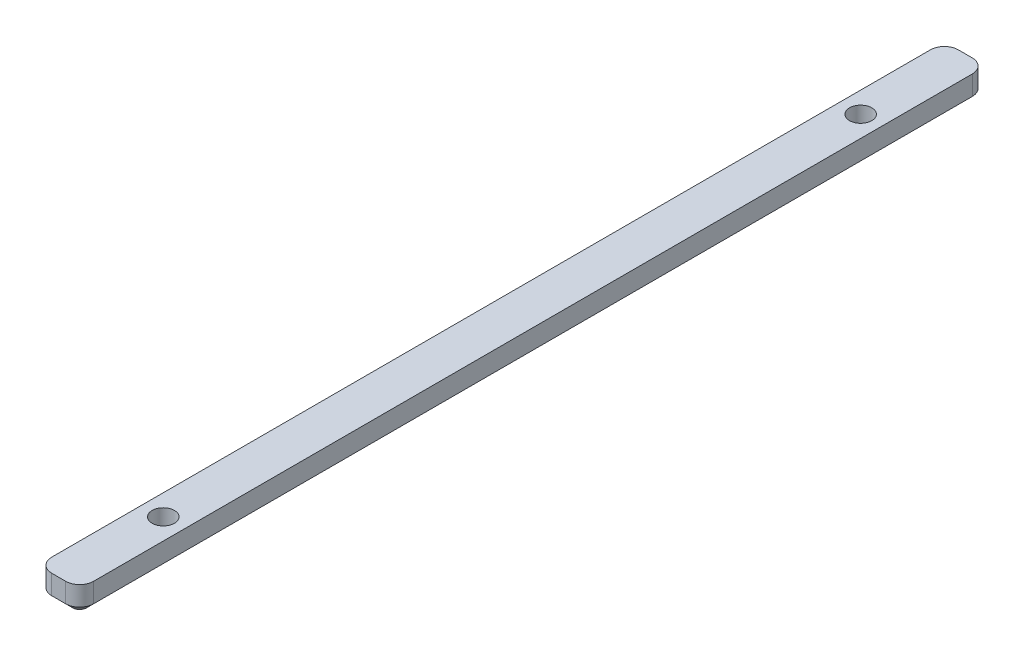
ISO-10303-21;
HEADER;
FILE_DESCRIPTION(('STEP AP214'),'2;1');
FILE_NAME('part.step','',(''),(''),'','','');
FILE_SCHEMA(('AUTOMOTIVE_DESIGN { 1 0 10303 214 1 1 1 1 }'));
ENDSEC;
DATA;
#1=APPLICATION_CONTEXT('core data for automotive mechanical design processes');
#2=APPLICATION_PROTOCOL_DEFINITION('international standard','automotive_design',2000,#1);
#3=PRODUCT_CONTEXT('',#1,'mechanical');
#4=PRODUCT('Part','Part','',(#3));
#5=PRODUCT_RELATED_PRODUCT_CATEGORY('part','',(#4));
#6=PRODUCT_DEFINITION_FORMATION('','',#4);
#7=PRODUCT_DEFINITION_CONTEXT('part definition',#1,'design');
#8=PRODUCT_DEFINITION('design','',#6,#7);
#9=PRODUCT_DEFINITION_SHAPE('','',#8);
#10=(LENGTH_UNIT() NAMED_UNIT(*) SI_UNIT(.MILLI.,.METRE.));
#11=(NAMED_UNIT(*) PLANE_ANGLE_UNIT() SI_UNIT($,.RADIAN.));
#12=(NAMED_UNIT(*) SI_UNIT($,.STERADIAN.) SOLID_ANGLE_UNIT());
#13=UNCERTAINTY_MEASURE_WITH_UNIT(LENGTH_MEASURE(1.E-05),#10,'distance_accuracy_value','');
#14=(GEOMETRIC_REPRESENTATION_CONTEXT(3) GLOBAL_UNCERTAINTY_ASSIGNED_CONTEXT((#13)) GLOBAL_UNIT_ASSIGNED_CONTEXT((#10,
#11,#12)) REPRESENTATION_CONTEXT('',''));
#15=CARTESIAN_POINT('',(0.,0.,0.));
#16=DIRECTION('',(0.,0.,1.));
#17=DIRECTION('',(1.,0.,0.));
#18=AXIS2_PLACEMENT_3D('',#15,#16,#17);
#19=CARTESIAN_POINT('',(0.,-9.15,176.));
#20=DIRECTION('',(0.,-1.,0.));
#21=DIRECTION('',(0.,0.,-1.));
#22=AXIS2_PLACEMENT_3D('',#19,#20,#21);
#23=PLANE('',#22);
#24=CARTESIAN_POINT('',(0.,-9.15,149.));
#25=DIRECTION('',(0.,-1.,0.));
#26=DIRECTION('',(0.,0.,-1.));
#27=AXIS2_PLACEMENT_3D('',#24,#25,#26);
#28=CIRCLE('',#27,4.25);
#29=CARTESIAN_POINT('',(-4.25000000000002,-9.15,149.));
#30=VERTEX_POINT('',#29);
#31=CARTESIAN_POINT('',(4.24999999999998,-9.15,149.));
#32=VERTEX_POINT('',#31);
#33=EDGE_CURVE('E19',#30,#32,#28,.T.);
#34=ORIENTED_EDGE('',*,*,#33,.T.);
#35=DIRECTION('',(0.,0.,-1.));
#36=VECTOR('',#35,1.);
#37=CARTESIAN_POINT('',(4.24999999999998,-9.15,176.));
#38=LINE('',#37,#36);
#39=CARTESIAN_POINT('',(4.24999999999998,-9.15,176.));
#40=VERTEX_POINT('',#39);
#41=EDGE_CURVE('E154',#32,#40,#38,.F.);
#42=ORIENTED_EDGE('',*,*,#41,.T.);
#43=CARTESIAN_POINT('',(0.,-9.15,176.));
#44=DIRECTION('',(0.,-1.,0.));
#45=DIRECTION('',(0.,0.,-1.));
#46=AXIS2_PLACEMENT_3D('',#43,#44,#45);
#47=CIRCLE('',#46,4.25);
#48=CARTESIAN_POINT('',(-4.25000000000002,-9.15,176.));
#49=VERTEX_POINT('',#48);
#50=EDGE_CURVE('E274',#40,#49,#47,.T.);
#51=ORIENTED_EDGE('',*,*,#50,.T.);
#52=DIRECTION('',(0.,0.,1.));
#53=VECTOR('',#52,1.);
#54=CARTESIAN_POINT('',(-4.25000000000002,-9.15,176.));
#55=LINE('',#54,#53);
#56=EDGE_CURVE('E157',#49,#30,#55,.F.);
#57=ORIENTED_EDGE('',*,*,#56,.T.);
#58=EDGE_LOOP('',(#34,#42,#51,#57));
#59=FACE_BOUND('',#58,.T.);
#60=ADVANCED_FACE('F16',(#59),#23,.T.);
#61=CARTESIAN_POINT('',(0.,-9.15,11.5));
#62=DIRECTION('',(0.,-1.,0.));
#63=DIRECTION('',(0.,0.,-1.));
#64=AXIS2_PLACEMENT_3D('',#61,#62,#63);
#65=PLANE('',#64);
#66=CARTESIAN_POINT('',(0.,-9.15,38.5));
#67=DIRECTION('',(0.,-1.,0.));
#68=DIRECTION('',(0.,0.,-1.));
#69=AXIS2_PLACEMENT_3D('',#66,#67,#68);
#70=CIRCLE('',#69,4.25);
#71=CARTESIAN_POINT('',(4.25,-9.15,38.5));
#72=VERTEX_POINT('',#71);
#73=CARTESIAN_POINT('',(-4.25000000000001,-9.15,38.5));
#74=VERTEX_POINT('',#73);
#75=EDGE_CURVE('E273',#72,#74,#70,.T.);
#76=ORIENTED_EDGE('',*,*,#75,.T.);
#77=DIRECTION('',(0.,0.,1.));
#78=VECTOR('',#77,1.);
#79=CARTESIAN_POINT('',(-4.25,-9.15,11.5));
#80=LINE('',#79,#78);
#81=CARTESIAN_POINT('',(-4.25,-9.15,11.5));
#82=VERTEX_POINT('',#81);
#83=EDGE_CURVE('E191',#74,#82,#80,.F.);
#84=ORIENTED_EDGE('',*,*,#83,.T.);
#85=CARTESIAN_POINT('',(0.,-9.15,11.5));
#86=DIRECTION('',(0.,-1.,0.));
#87=DIRECTION('',(0.,0.,-1.));
#88=AXIS2_PLACEMENT_3D('',#85,#86,#87);
#89=CIRCLE('',#88,4.25);
#90=CARTESIAN_POINT('',(4.25,-9.15,11.5));
#91=VERTEX_POINT('',#90);
#92=EDGE_CURVE('E271',#82,#91,#89,.T.);
#93=ORIENTED_EDGE('',*,*,#92,.T.);
#94=DIRECTION('',(0.,0.,-1.));
#95=VECTOR('',#94,1.);
#96=CARTESIAN_POINT('',(4.25,-9.15,11.5));
#97=LINE('',#96,#95);
#98=EDGE_CURVE('E186',#91,#72,#97,.F.);
#99=ORIENTED_EDGE('',*,*,#98,.T.);
#100=EDGE_LOOP('',(#76,#84,#93,#99));
#101=FACE_BOUND('',#100,.T.);
#102=ADVANCED_FACE('F321',(#101),#65,.T.);
#103=CARTESIAN_POINT('',(0.,-9.15,313.5));
#104=DIRECTION('',(0.,-1.,0.));
#105=DIRECTION('',(0.,0.,-1.));
#106=AXIS2_PLACEMENT_3D('',#103,#104,#105);
#107=PLANE('',#106);
#108=CARTESIAN_POINT('',(0.,-9.15,286.5));
#109=DIRECTION('',(0.,-1.,0.));
#110=DIRECTION('',(0.,0.,-1.));
#111=AXIS2_PLACEMENT_3D('',#108,#109,#110);
#112=CIRCLE('',#111,4.24999999999998);
#113=CARTESIAN_POINT('',(-4.25,-9.15,286.5));
#114=VERTEX_POINT('',#113);
#115=CARTESIAN_POINT('',(4.25000000000001,-9.15,286.5));
#116=VERTEX_POINT('',#115);
#117=EDGE_CURVE('E269',#114,#116,#112,.T.);
#118=ORIENTED_EDGE('',*,*,#117,.T.);
#119=DIRECTION('',(0.,0.,-1.));
#120=VECTOR('',#119,1.);
#121=CARTESIAN_POINT('',(4.25,-9.15,313.5));
#122=LINE('',#121,#120);
#123=CARTESIAN_POINT('',(4.25000000000002,-9.15,313.5));
#124=VERTEX_POINT('',#123);
#125=EDGE_CURVE('E182',#116,#124,#122,.F.);
#126=ORIENTED_EDGE('',*,*,#125,.T.);
#127=CARTESIAN_POINT('',(0.,-9.15,313.5));
#128=DIRECTION('',(0.,-1.,0.));
#129=DIRECTION('',(0.,0.,-1.));
#130=AXIS2_PLACEMENT_3D('',#127,#128,#129);
#131=CIRCLE('',#130,4.24999999999998);
#132=CARTESIAN_POINT('',(-4.25000000000001,-9.15,313.5));
#133=VERTEX_POINT('',#132);
#134=EDGE_CURVE('E267',#124,#133,#131,.T.);
#135=ORIENTED_EDGE('',*,*,#134,.T.);
#136=DIRECTION('',(0.,0.,1.));
#137=VECTOR('',#136,1.);
#138=CARTESIAN_POINT('',(-4.25000000000001,-9.15,313.5));
#139=LINE('',#138,#137);
#140=EDGE_CURVE('E177',#133,#114,#139,.F.);
#141=ORIENTED_EDGE('',*,*,#140,.T.);
#142=EDGE_LOOP('',(#118,#126,#135,#141));
#143=FACE_BOUND('',#142,.T.);
#144=ADVANCED_FACE('F805',(#143),#107,.T.);
#145=CARTESIAN_POINT('',(0.,-9.15,149.));
#146=DIRECTION('',(0.,-1.,0.));
#147=DIRECTION('',(0.,0.,-1.));
#148=AXIS2_PLACEMENT_3D('',#145,#146,#147);
#149=CYLINDRICAL_SURFACE('',#148,4.25);
#150=ORIENTED_EDGE('',*,*,#33,.F.);
#151=DIRECTION('',(0.,1.,0.));
#152=VECTOR('',#151,1.);
#153=CARTESIAN_POINT('',(-4.25000000000002,-9.15,149.));
#154=LINE('',#153,#152);
#155=CARTESIAN_POINT('',(-4.25000000000002,-9.5,149.));
#156=VERTEX_POINT('',#155);
#157=EDGE_CURVE('E196',#30,#156,#154,.F.);
#158=ORIENTED_EDGE('',*,*,#157,.T.);
#159=CARTESIAN_POINT('',(0.,-9.5,149.));
#160=DIRECTION('',(0.,-1.,0.));
#161=DIRECTION('',(0.,0.,-1.));
#162=AXIS2_PLACEMENT_3D('',#159,#160,#161);
#163=CIRCLE('',#162,4.25);
#164=CARTESIAN_POINT('',(4.24999999999998,-9.5,149.));
#165=VERTEX_POINT('',#164);
#166=EDGE_CURVE('E172',#156,#165,#163,.T.);
#167=ORIENTED_EDGE('',*,*,#166,.T.);
#168=DIRECTION('',(0.,1.,0.));
#169=VECTOR('',#168,1.);
#170=CARTESIAN_POINT('',(4.24999999999998,-9.15,149.));
#171=LINE('',#170,#169);
#172=EDGE_CURVE('E162',#165,#32,#171,.T.);
#173=ORIENTED_EDGE('',*,*,#172,.T.);
#174=EDGE_LOOP('',(#150,#158,#167,#173));
#175=FACE_BOUND('',#174,.T.);
#176=ADVANCED_FACE('F171',(#175),#149,.F.);
#177=CARTESIAN_POINT('',(4.24999999999998,-9.15,176.));
#178=DIRECTION('',(1.,0.,0.));
#179=DIRECTION('',(0.,0.,-1.));
#180=AXIS2_PLACEMENT_3D('',#177,#178,#179);
#181=PLANE('',#180);
#182=DIRECTION('',(0.,-1.,0.));
#183=VECTOR('',#182,1.);
#184=CARTESIAN_POINT('',(4.24999999999998,-9.15,176.));
#185=LINE('',#184,#183);
#186=CARTESIAN_POINT('',(4.24999999999998,-9.5,176.));
#187=VERTEX_POINT('',#186);
#188=EDGE_CURVE('E168',#187,#40,#185,.F.);
#189=ORIENTED_EDGE('',*,*,#188,.T.);
#190=ORIENTED_EDGE('',*,*,#41,.F.);
#191=ORIENTED_EDGE('',*,*,#172,.F.);
#192=DIRECTION('',(0.,0.,1.));
#193=VECTOR('',#192,1.);
#194=CARTESIAN_POINT('',(4.24999999999998,-9.5,325.));
#195=LINE('',#194,#193);
#196=EDGE_CURVE('E265',#165,#187,#195,.T.);
#197=ORIENTED_EDGE('',*,*,#196,.T.);
#198=EDGE_LOOP('',(#189,#190,#191,#197));
#199=FACE_BOUND('',#198,.T.);
#200=ADVANCED_FACE('F165',(#199),#181,.F.);
#201=CARTESIAN_POINT('',(0.,-9.15,176.));
#202=DIRECTION('',(0.,-1.,0.));
#203=DIRECTION('',(0.,0.,-1.));
#204=AXIS2_PLACEMENT_3D('',#201,#202,#203);
#205=CYLINDRICAL_SURFACE('',#204,4.25);
#206=DIRECTION('',(0.,1.,0.));
#207=VECTOR('',#206,1.);
#208=CARTESIAN_POINT('',(-4.25000000000002,-9.15,176.));
#209=LINE('',#208,#207);
#210=CARTESIAN_POINT('',(-4.25000000000002,-9.5,176.));
#211=VERTEX_POINT('',#210);
#212=EDGE_CURVE('E197',#211,#49,#209,.T.);
#213=ORIENTED_EDGE('',*,*,#212,.T.);
#214=ORIENTED_EDGE('',*,*,#50,.F.);
#215=ORIENTED_EDGE('',*,*,#188,.F.);
#216=CARTESIAN_POINT('',(0.,-9.5,176.));
#217=DIRECTION('',(0.,-1.,0.));
#218=DIRECTION('',(0.,0.,-1.));
#219=AXIS2_PLACEMENT_3D('',#216,#217,#218);
#220=CIRCLE('',#219,4.25);
#221=EDGE_CURVE('E262',#187,#211,#220,.T.);
#222=ORIENTED_EDGE('',*,*,#221,.T.);
#223=EDGE_LOOP('',(#213,#214,#215,#222));
#224=FACE_BOUND('',#223,.T.);
#225=ADVANCED_FACE('F783',(#224),#205,.F.);
#226=CARTESIAN_POINT('',(-4.25000000000002,-9.15,176.));
#227=DIRECTION('',(-1.,0.,0.));
#228=DIRECTION('',(0.,0.,1.));
#229=AXIS2_PLACEMENT_3D('',#226,#227,#228);
#230=PLANE('',#229);
#231=ORIENTED_EDGE('',*,*,#157,.F.);
#232=ORIENTED_EDGE('',*,*,#56,.F.);
#233=ORIENTED_EDGE('',*,*,#212,.F.);
#234=DIRECTION('',(0.,0.,1.));
#235=VECTOR('',#234,1.);
#236=CARTESIAN_POINT('',(-4.25000000000002,-9.5,325.));
#237=LINE('',#236,#235);
#238=EDGE_CURVE('E261',#211,#156,#237,.F.);
#239=ORIENTED_EDGE('',*,*,#238,.T.);
#240=EDGE_LOOP('',(#231,#232,#233,#239));
#241=FACE_BOUND('',#240,.T.);
#242=ADVANCED_FACE('F283',(#241),#230,.F.);
#243=CARTESIAN_POINT('',(0.,-9.15,38.5));
#244=DIRECTION('',(0.,-1.,0.));
#245=DIRECTION('',(0.,0.,-1.));
#246=AXIS2_PLACEMENT_3D('',#243,#244,#245);
#247=CYLINDRICAL_SURFACE('',#246,4.25);
#248=DIRECTION('',(0.,1.,0.));
#249=VECTOR('',#248,1.);
#250=CARTESIAN_POINT('',(-4.25000000000001,-9.15,38.5));
#251=LINE('',#250,#249);
#252=CARTESIAN_POINT('',(-4.25000000000001,-9.5,38.5));
#253=VERTEX_POINT('',#252);
#254=EDGE_CURVE('E195',#253,#74,#251,.T.);
#255=ORIENTED_EDGE('',*,*,#254,.T.);
#256=ORIENTED_EDGE('',*,*,#75,.F.);
#257=DIRECTION('',(0.,1.,0.));
#258=VECTOR('',#257,1.);
#259=CARTESIAN_POINT('',(4.25,-9.15,38.5));
#260=LINE('',#259,#258);
#261=CARTESIAN_POINT('',(4.25,-9.5,38.5));
#262=VERTEX_POINT('',#261);
#263=EDGE_CURVE('E189',#72,#262,#260,.F.);
#264=ORIENTED_EDGE('',*,*,#263,.T.);
#265=CARTESIAN_POINT('',(0.,-9.5,38.5));
#266=DIRECTION('',(0.,-1.,0.));
#267=DIRECTION('',(0.,0.,-1.));
#268=AXIS2_PLACEMENT_3D('',#265,#266,#267);
#269=CIRCLE('',#268,4.25);
#270=EDGE_CURVE('E258',#262,#253,#269,.T.);
#271=ORIENTED_EDGE('',*,*,#270,.T.);
#272=EDGE_LOOP('',(#255,#256,#264,#271));
#273=FACE_BOUND('',#272,.T.);
#274=ADVANCED_FACE('F324',(#273),#247,.F.);
#275=CARTESIAN_POINT('',(-4.25,-9.15,11.5));
#276=DIRECTION('',(-1.,0.,0.));
#277=DIRECTION('',(0.,0.,1.));
#278=AXIS2_PLACEMENT_3D('',#275,#276,#277);
#279=PLANE('',#278);
#280=DIRECTION('',(0.,-1.,0.));
#281=VECTOR('',#280,1.);
#282=CARTESIAN_POINT('',(-4.25,-9.15,11.5));
#283=LINE('',#282,#281);
#284=CARTESIAN_POINT('',(-4.25000000000001,-9.5,11.5));
#285=VERTEX_POINT('',#284);
#286=EDGE_CURVE('E194',#285,#82,#283,.F.);
#287=ORIENTED_EDGE('',*,*,#286,.T.);
#288=ORIENTED_EDGE('',*,*,#83,.F.);
#289=ORIENTED_EDGE('',*,*,#254,.F.);
#290=DIRECTION('',(0.,0.,1.));
#291=VECTOR('',#290,1.);
#292=CARTESIAN_POINT('',(-4.25000000000001,-9.5,325.));
#293=LINE('',#292,#291);
#294=EDGE_CURVE('E257',#253,#285,#293,.F.);
#295=ORIENTED_EDGE('',*,*,#294,.T.);
#296=EDGE_LOOP('',(#287,#288,#289,#295));
#297=FACE_BOUND('',#296,.T.);
#298=ADVANCED_FACE('F314',(#297),#279,.F.);
#299=CARTESIAN_POINT('',(0.,-9.15,11.5));
#300=DIRECTION('',(0.,-1.,0.));
#301=DIRECTION('',(0.,0.,-1.));
#302=AXIS2_PLACEMENT_3D('',#299,#300,#301);
#303=CYLINDRICAL_SURFACE('',#302,4.25);
#304=ORIENTED_EDGE('',*,*,#92,.F.);
#305=ORIENTED_EDGE('',*,*,#286,.F.);
#306=CARTESIAN_POINT('',(0.,-9.5,11.5));
#307=DIRECTION('',(0.,-1.,0.));
#308=DIRECTION('',(0.,0.,-1.));
#309=AXIS2_PLACEMENT_3D('',#306,#307,#308);
#310=CIRCLE('',#309,4.25);
#311=CARTESIAN_POINT('',(4.25000000000001,-9.5,11.5));
#312=VERTEX_POINT('',#311);
#313=EDGE_CURVE('E254',#285,#312,#310,.T.);
#314=ORIENTED_EDGE('',*,*,#313,.T.);
#315=DIRECTION('',(0.,1.,0.));
#316=VECTOR('',#315,1.);
#317=CARTESIAN_POINT('',(4.25,-9.15,11.5));
#318=LINE('',#317,#316);
#319=EDGE_CURVE('E190',#312,#91,#318,.T.);
#320=ORIENTED_EDGE('',*,*,#319,.T.);
#321=EDGE_LOOP('',(#304,#305,#314,#320));
#322=FACE_BOUND('',#321,.T.);
#323=ADVANCED_FACE('F318',(#322),#303,.F.);
#324=CARTESIAN_POINT('',(4.25,-9.15,11.5));
#325=DIRECTION('',(1.,0.,0.));
#326=DIRECTION('',(0.,0.,-1.));
#327=AXIS2_PLACEMENT_3D('',#324,#325,#326);
#328=PLANE('',#327);
#329=ORIENTED_EDGE('',*,*,#263,.F.);
#330=ORIENTED_EDGE('',*,*,#98,.F.);
#331=ORIENTED_EDGE('',*,*,#319,.F.);
#332=DIRECTION('',(0.,0.,1.));
#333=VECTOR('',#332,1.);
#334=CARTESIAN_POINT('',(4.25000000000001,-9.5,325.));
#335=LINE('',#334,#333);
#336=EDGE_CURVE('E253',#312,#262,#335,.T.);
#337=ORIENTED_EDGE('',*,*,#336,.T.);
#338=EDGE_LOOP('',(#329,#330,#331,#337));
#339=FACE_BOUND('',#338,.T.);
#340=ADVANCED_FACE('F327',(#339),#328,.F.);
#341=CARTESIAN_POINT('',(0.,-9.15,286.5));
#342=DIRECTION('',(0.,-1.,0.));
#343=DIRECTION('',(0.,0.,-1.));
#344=AXIS2_PLACEMENT_3D('',#341,#342,#343);
#345=CYLINDRICAL_SURFACE('',#344,4.24999999999998);
#346=ORIENTED_EDGE('',*,*,#117,.F.);
#347=DIRECTION('',(0.,1.,0.));
#348=VECTOR('',#347,1.);
#349=CARTESIAN_POINT('',(-4.25,-9.15,286.5));
#350=LINE('',#349,#348);
#351=CARTESIAN_POINT('',(-4.25,-9.5,286.5));
#352=VERTEX_POINT('',#351);
#353=EDGE_CURVE('E180',#114,#352,#350,.F.);
#354=ORIENTED_EDGE('',*,*,#353,.T.);
#355=CARTESIAN_POINT('',(0.,-9.5,286.5));
#356=DIRECTION('',(0.,-1.,0.));
#357=DIRECTION('',(0.,0.,-1.));
#358=AXIS2_PLACEMENT_3D('',#355,#356,#357);
#359=CIRCLE('',#358,4.24999999999998);
#360=CARTESIAN_POINT('',(4.25000000000001,-9.5,286.5));
#361=VERTEX_POINT('',#360);
#362=EDGE_CURVE('E250',#352,#361,#359,.T.);
#363=ORIENTED_EDGE('',*,*,#362,.T.);
#364=DIRECTION('',(0.,1.,0.));
#365=VECTOR('',#364,1.);
#366=CARTESIAN_POINT('',(4.25000000000001,-9.15,286.5));
#367=LINE('',#366,#365);
#368=EDGE_CURVE('E185',#361,#116,#367,.T.);
#369=ORIENTED_EDGE('',*,*,#368,.T.);
#370=EDGE_LOOP('',(#346,#354,#363,#369));
#371=FACE_BOUND('',#370,.T.);
#372=ADVANCED_FACE('F738',(#371),#345,.F.);
#373=CARTESIAN_POINT('',(4.25,-9.15,313.5));
#374=DIRECTION('',(1.,0.,0.));
#375=DIRECTION('',(0.,0.,-1.));
#376=AXIS2_PLACEMENT_3D('',#373,#374,#375);
#377=PLANE('',#376);
#378=DIRECTION('',(0.,-1.,0.));
#379=VECTOR('',#378,1.);
#380=CARTESIAN_POINT('',(4.25000000000004,-9.15,313.5));
#381=LINE('',#380,#379);
#382=CARTESIAN_POINT('',(4.25000000000002,-9.5,313.5));
#383=VERTEX_POINT('',#382);
#384=EDGE_CURVE('E184',#383,#124,#381,.F.);
#385=ORIENTED_EDGE('',*,*,#384,.T.);
#386=ORIENTED_EDGE('',*,*,#125,.F.);
#387=ORIENTED_EDGE('',*,*,#368,.F.);
#388=DIRECTION('',(0.,0.,1.));
#389=VECTOR('',#388,1.);
#390=CARTESIAN_POINT('',(4.25000000000001,-9.5,325.));
#391=LINE('',#390,#389);
#392=EDGE_CURVE('E249',#361,#383,#391,.T.);
#393=ORIENTED_EDGE('',*,*,#392,.T.);
#394=EDGE_LOOP('',(#385,#386,#387,#393));
#395=FACE_BOUND('',#394,.T.);
#396=ADVANCED_FACE('F729',(#395),#377,.F.);
#397=CARTESIAN_POINT('',(0.,-9.15,313.5));
#398=DIRECTION('',(0.,-1.,0.));
#399=DIRECTION('',(0.,0.,-1.));
#400=AXIS2_PLACEMENT_3D('',#397,#398,#399);
#401=CYLINDRICAL_SURFACE('',#400,4.24999999999998);
#402=DIRECTION('',(0.,1.,0.));
#403=VECTOR('',#402,1.);
#404=CARTESIAN_POINT('',(-4.25000000000001,-9.15,313.5));
#405=LINE('',#404,#403);
#406=CARTESIAN_POINT('',(-4.25000000000001,-9.5,313.5));
#407=VERTEX_POINT('',#406);
#408=EDGE_CURVE('E181',#407,#133,#405,.T.);
#409=ORIENTED_EDGE('',*,*,#408,.T.);
#410=ORIENTED_EDGE('',*,*,#134,.F.);
#411=ORIENTED_EDGE('',*,*,#384,.F.);
#412=CARTESIAN_POINT('',(0.,-9.5,313.5));
#413=DIRECTION('',(0.,-1.,0.));
#414=DIRECTION('',(0.,0.,-1.));
#415=AXIS2_PLACEMENT_3D('',#412,#413,#414);
#416=CIRCLE('',#415,4.24999999999998);
#417=EDGE_CURVE('E246',#383,#407,#416,.T.);
#418=ORIENTED_EDGE('',*,*,#417,.T.);
#419=EDGE_LOOP('',(#409,#410,#411,#418));
#420=FACE_BOUND('',#419,.T.);
#421=ADVANCED_FACE('F720',(#420),#401,.F.);
#422=CARTESIAN_POINT('',(-4.25000000000001,-9.15,313.5));
#423=DIRECTION('',(-1.,0.,0.));
#424=DIRECTION('',(0.,0.,1.));
#425=AXIS2_PLACEMENT_3D('',#422,#423,#424);
#426=PLANE('',#425);
#427=ORIENTED_EDGE('',*,*,#353,.F.);
#428=ORIENTED_EDGE('',*,*,#140,.F.);
#429=ORIENTED_EDGE('',*,*,#408,.F.);
#430=DIRECTION('',(0.,0.,1.));
#431=VECTOR('',#430,1.);
#432=CARTESIAN_POINT('',(-4.25000000000001,-9.5,325.));
#433=LINE('',#432,#431);
#434=EDGE_CURVE('E245',#407,#352,#433,.F.);
#435=ORIENTED_EDGE('',*,*,#434,.T.);
#436=EDGE_LOOP('',(#427,#428,#429,#435));
#437=FACE_BOUND('',#436,.T.);
#438=ADVANCED_FACE('F712',(#437),#426,.F.);
#439=CARTESIAN_POINT('',(-7.5,-9.5,325.));
#440=DIRECTION('',(0.,1.,0.));
#441=DIRECTION('',(0.,0.,1.));
#442=AXIS2_PLACEMENT_3D('',#439,#440,#441);
#443=PLANE('',#442);
#444=CARTESIAN_POINT('',(-2.5,-9.50000000000273,320.));
#445=DIRECTION('',(0.,1.,0.));
#446=DIRECTION('',(-1.,0.,0.));
#447=AXIS2_PLACEMENT_3D('',#444,#445,#446);
#448=CIRCLE('',#447,2.49999999993861);
#449=CARTESIAN_POINT('',(-4.9999999999986,-9.50000000000136,320.));
#450=VERTEX_POINT('',#449);
#451=CARTESIAN_POINT('',(-2.50000000000001,-9.50000000000273,322.499999999942));
#452=VERTEX_POINT('',#451);
#453=EDGE_CURVE('E232',#450,#452,#448,.T.);
#454=ORIENTED_EDGE('',*,*,#453,.F.);
#455=DIRECTION('',(0.,0.,1.));
#456=VECTOR('',#455,1.);
#457=CARTESIAN_POINT('',(-4.99999999999997,-9.5,325.));
#458=LINE('',#457,#456);
#459=CARTESIAN_POINT('',(-4.99999999999884,-9.49999999995942,5.00000000000002));
#460=VERTEX_POINT('',#459);
#461=EDGE_CURVE('E231',#450,#460,#458,.F.);
#462=ORIENTED_EDGE('',*,*,#461,.T.);
#463=CARTESIAN_POINT('',(-2.5,-9.49999999994589,5.));
#464=DIRECTION('',(0.,1.,0.));
#465=DIRECTION('',(-1.,0.,0.));
#466=AXIS2_PLACEMENT_3D('',#463,#464,#465);
#467=CIRCLE('',#466,2.49999999999545);
#468=CARTESIAN_POINT('',(-2.5,-9.49999999997295,2.49999999997295));
#469=VERTEX_POINT('',#468);
#470=EDGE_CURVE('E228',#469,#460,#467,.T.);
#471=ORIENTED_EDGE('',*,*,#470,.F.);
#472=DIRECTION('',(1.,0.,0.));
#473=VECTOR('',#472,1.);
#474=CARTESIAN_POINT('',(-7.5,-9.50000000000002,2.50000000000002));
#475=LINE('',#474,#473);
#476=CARTESIAN_POINT('',(2.5,-9.49999999997295,2.49999999997295));
#477=VERTEX_POINT('',#476);
#478=EDGE_CURVE('E335',#469,#477,#475,.T.);
#479=ORIENTED_EDGE('',*,*,#478,.T.);
#480=CARTESIAN_POINT('',(2.5,-9.49999999994589,5.));
#481=DIRECTION('',(0.,1.,0.));
#482=DIRECTION('',(0.,0.,1.));
#483=AXIS2_PLACEMENT_3D('',#480,#481,#482);
#484=CIRCLE('',#483,2.50000000005684);
#485=CARTESIAN_POINT('',(5.00000000002703,-9.49999999997294,5.));
#486=VERTEX_POINT('',#485);
#487=EDGE_CURVE('E242',#486,#477,#484,.T.);
#488=ORIENTED_EDGE('',*,*,#487,.F.);
#489=DIRECTION('',(0.,0.,1.));
#490=VECTOR('',#489,1.);
#491=CARTESIAN_POINT('',(4.99999999999997,-9.5,325.));
#492=LINE('',#491,#490);
#493=CARTESIAN_POINT('',(5.00000000004035,-9.50000000000204,320.));
#494=VERTEX_POINT('',#493);
#495=EDGE_CURVE('E244',#486,#494,#492,.T.);
#496=ORIENTED_EDGE('',*,*,#495,.T.);
#497=CARTESIAN_POINT('',(2.5,-9.50000000000272,320.));
#498=DIRECTION('',(0.,1.,0.));
#499=DIRECTION('',(-1.,0.,0.));
#500=AXIS2_PLACEMENT_3D('',#497,#498,#499);
#501=CIRCLE('',#500,2.5);
#502=CARTESIAN_POINT('',(2.5,-9.50000000000136,322.499999999999));
#503=VERTEX_POINT('',#502);
#504=EDGE_CURVE('E237',#503,#494,#501,.T.);
#505=ORIENTED_EDGE('',*,*,#504,.F.);
#506=DIRECTION('',(1.,0.,0.));
#507=VECTOR('',#506,1.);
#508=CARTESIAN_POINT('',(0.,-9.5,322.5));
#509=LINE('',#508,#507);
#510=EDGE_CURVE('E293',#452,#503,#509,.T.);
#511=ORIENTED_EDGE('',*,*,#510,.F.);
#512=EDGE_LOOP('',(#454,#462,#471,#479,#488,#496,#505,#511));
#513=FACE_BOUND('',#512,.T.);
#514=ORIENTED_EDGE('',*,*,#417,.F.);
#515=ORIENTED_EDGE('',*,*,#392,.F.);
#516=ORIENTED_EDGE('',*,*,#362,.F.);
#517=ORIENTED_EDGE('',*,*,#434,.F.);
#518=EDGE_LOOP('',(#514,#515,#516,#517));
#519=FACE_BOUND('',#518,.T.);
#520=ORIENTED_EDGE('',*,*,#313,.F.);
#521=ORIENTED_EDGE('',*,*,#294,.F.);
#522=ORIENTED_EDGE('',*,*,#270,.F.);
#523=ORIENTED_EDGE('',*,*,#336,.F.);
#524=EDGE_LOOP('',(#520,#521,#522,#523));
#525=FACE_BOUND('',#524,.T.);
#526=ORIENTED_EDGE('',*,*,#221,.F.);
#527=ORIENTED_EDGE('',*,*,#196,.F.);
#528=ORIENTED_EDGE('',*,*,#166,.F.);
#529=ORIENTED_EDGE('',*,*,#238,.F.);
#530=EDGE_LOOP('',(#526,#527,#528,#529));
#531=FACE_BOUND('',#530,.T.);
#532=ADVANCED_FACE('F505',(#513,#519,#525,#531),#443,.F.);
#533=CARTESIAN_POINT('',(0.,-6.,287.5));
#534=DIRECTION('',(0.,1.,0.));
#535=DIRECTION('',(0.,0.,1.));
#536=AXIS2_PLACEMENT_3D('',#533,#534,#535);
#537=PLANE('',#536);
#538=CARTESIAN_POINT('',(0.,-6.,287.5));
#539=DIRECTION('',(0.,1.,0.));
#540=DIRECTION('',(0.,0.,1.));
#541=AXIS2_PLACEMENT_3D('',#538,#539,#540);
#542=CIRCLE('',#541,4.);
#543=CARTESIAN_POINT('',(0.,-6.,291.5));
#544=VERTEX_POINT('',#543);
#545=EDGE_CURVE('E224',#544,#544,#542,.T.);
#546=ORIENTED_EDGE('',*,*,#545,.T.);
#547=EDGE_LOOP('',(#546));
#548=FACE_BOUND('',#547,.T.);
#549=ADVANCED_FACE('F695',(#548),#537,.T.);
#550=CARTESIAN_POINT('',(0.,-6.,37.5));
#551=DIRECTION('',(0.,1.,0.));
#552=DIRECTION('',(0.,0.,1.));
#553=AXIS2_PLACEMENT_3D('',#550,#551,#552);
#554=PLANE('',#553);
#555=CARTESIAN_POINT('',(0.,-6.,37.5));
#556=DIRECTION('',(0.,1.,0.));
#557=DIRECTION('',(0.,0.,1.));
#558=AXIS2_PLACEMENT_3D('',#555,#556,#557);
#559=CIRCLE('',#558,4.);
#560=CARTESIAN_POINT('',(0.,-6.,41.5));
#561=VERTEX_POINT('',#560);
#562=EDGE_CURVE('E220',#561,#561,#559,.T.);
#563=ORIENTED_EDGE('',*,*,#562,.T.);
#564=EDGE_LOOP('',(#563));
#565=FACE_BOUND('',#564,.T.);
#566=ADVANCED_FACE('F687',(#565),#554,.T.);
#567=CARTESIAN_POINT('',(2.5,-6.99999999994816,5.));
#568=DIRECTION('',(0.,1.,0.));
#569=DIRECTION('',(0.,0.,1.));
#570=AXIS2_PLACEMENT_3D('',#567,#568,#569);
#571=CONICAL_SURFACE('',#570,5.00000000005457,0.785398163397449);
#572=DIRECTION('',(-0.707106781186548,-0.707106781186547,0.));
#573=VECTOR('',#572,1.);
#574=CARTESIAN_POINT('',(7.5,-6.99999999999997,5.));
#575=LINE('',#574,#573);
#576=CARTESIAN_POINT('',(7.5,-6.99999999999997,5.));
#577=VERTEX_POINT('',#576);
#578=EDGE_CURVE('E297',#577,#486,#575,.T.);
#579=ORIENTED_EDGE('',*,*,#578,.T.);
#580=ORIENTED_EDGE('',*,*,#487,.T.);
#581=DIRECTION('',(0.,-0.707106781186552,0.707106781186544));
#582=VECTOR('',#581,1.);
#583=CARTESIAN_POINT('',(2.5,-9.5,2.5));
#584=LINE('',#583,#582);
#585=CARTESIAN_POINT('',(2.5,-6.99999999999997,0.));
#586=VERTEX_POINT('',#585);
#587=EDGE_CURVE('E227',#477,#586,#584,.F.);
#588=ORIENTED_EDGE('',*,*,#587,.T.);
#589=CARTESIAN_POINT('',(2.5,-6.99999999999997,5.));
#590=DIRECTION('',(0.,1.,0.));
#591=DIRECTION('',(-1.,0.,0.));
#592=AXIS2_PLACEMENT_3D('',#589,#590,#591);
#593=CIRCLE('',#592,5.);
#594=EDGE_CURVE('E223',#577,#586,#593,.T.);
#595=ORIENTED_EDGE('',*,*,#594,.F.);
#596=EDGE_LOOP('',(#579,#580,#588,#595));
#597=FACE_BOUND('',#596,.T.);
#598=ADVANCED_FACE('F489',(#597),#571,.T.);
#599=CARTESIAN_POINT('',(7.5,-6.99999999999997,325.));
#600=DIRECTION('',(-0.707106781186547,0.707106781186548,0.));
#601=DIRECTION('',(-0.707106781186548,-0.707106781186547,0.));
#602=AXIS2_PLACEMENT_3D('',#599,#600,#601);
#603=PLANE('',#602);
#604=DIRECTION('',(0.,0.,1.));
#605=VECTOR('',#604,1.);
#606=CARTESIAN_POINT('',(7.5,-6.99999999999997,325.));
#607=LINE('',#606,#605);
#608=CARTESIAN_POINT('',(7.5000000000125,-7.00000000000123,320.));
#609=VERTEX_POINT('',#608);
#610=EDGE_CURVE('E349',#577,#609,#607,.T.);
#611=ORIENTED_EDGE('',*,*,#610,.T.);
#612=DIRECTION('',(-0.707106781186551,-0.707106781186544,0.));
#613=VECTOR('',#612,1.);
#614=CARTESIAN_POINT('',(499005.,498990.499999995,320.000000000061));
#615=LINE('',#614,#613);
#616=EDGE_CURVE('E241',#494,#609,#615,.F.);
#617=ORIENTED_EDGE('',*,*,#616,.F.);
#618=ORIENTED_EDGE('',*,*,#495,.F.);
#619=ORIENTED_EDGE('',*,*,#578,.F.);
#620=EDGE_LOOP('',(#611,#617,#618,#619));
#621=FACE_BOUND('',#620,.T.);
#622=ADVANCED_FACE('F483',(#621),#603,.F.);
#623=CARTESIAN_POINT('',(2.5,-7.000000000005,320.));
#624=DIRECTION('',(0.,1.,0.));
#625=DIRECTION('',(-1.,0.,0.));
#626=AXIS2_PLACEMENT_3D('',#623,#624,#625);
#627=CONICAL_SURFACE('',#626,5.00000000005457,0.785398163408817);
#628=DIRECTION('',(0.,-0.707106781186552,-0.707106781186544));
#629=VECTOR('',#628,1.);
#630=CARTESIAN_POINT('',(2.5,-6.99999999999997,325.));
#631=LINE('',#630,#629);
#632=CARTESIAN_POINT('',(2.5,-6.99999999999997,325.));
#633=VERTEX_POINT('',#632);
#634=EDGE_CURVE('E240',#503,#633,#631,.F.);
#635=ORIENTED_EDGE('',*,*,#634,.F.);
#636=ORIENTED_EDGE('',*,*,#504,.T.);
#637=ORIENTED_EDGE('',*,*,#616,.T.);
#638=CARTESIAN_POINT('',(2.5,-6.99999999999997,320.));
#639=DIRECTION('',(0.,-1.,0.));
#640=DIRECTION('',(1.,0.,0.));
#641=AXIS2_PLACEMENT_3D('',#638,#639,#640);
#642=CIRCLE('',#641,5.);
#643=EDGE_CURVE('E352',#633,#609,#642,.F.);
#644=ORIENTED_EDGE('',*,*,#643,.F.);
#645=EDGE_LOOP('',(#635,#636,#637,#644));
#646=FACE_BOUND('',#645,.T.);
#647=ADVANCED_FACE('F503',(#646),#627,.T.);
#648=CARTESIAN_POINT('',(0.,-6.99999999999997,325.));
#649=DIRECTION('',(0.,-0.707106781186544,0.707106781186552));
#650=DIRECTION('',(0.,-0.707106781186552,-0.707106781186544));
#651=AXIS2_PLACEMENT_3D('',#648,#649,#650);
#652=PLANE('',#651);
#653=DIRECTION('',(0.,-0.707106781186548,-0.707106781186547));
#654=VECTOR('',#653,1.);
#655=CARTESIAN_POINT('',(-2.50000000022793,498985.5,499317.5));
#656=LINE('',#655,#654);
#657=CARTESIAN_POINT('',(-2.5,-7.00000000001544,324.999999999954));
#658=VERTEX_POINT('',#657);
#659=EDGE_CURVE('E236',#452,#658,#656,.F.);
#660=ORIENTED_EDGE('',*,*,#659,.F.);
#661=ORIENTED_EDGE('',*,*,#510,.T.);
#662=ORIENTED_EDGE('',*,*,#634,.T.);
#663=DIRECTION('',(1.,0.,0.));
#664=VECTOR('',#663,1.);
#665=CARTESIAN_POINT('',(0.,-6.99999999999997,325.));
#666=LINE('',#665,#664);
#667=EDGE_CURVE('E369',#658,#633,#666,.T.);
#668=ORIENTED_EDGE('',*,*,#667,.F.);
#669=EDGE_LOOP('',(#660,#661,#662,#668));
#670=FACE_BOUND('',#669,.T.);
#671=ADVANCED_FACE('F508',(#670),#652,.T.);
#672=CARTESIAN_POINT('',(-2.5,-7.00000000006184,320.));
#673=DIRECTION('',(0.,1.,0.));
#674=DIRECTION('',(-1.,0.,0.));
#675=AXIS2_PLACEMENT_3D('',#672,#673,#674);
#676=CONICAL_SURFACE('',#675,4.99999999987949,0.785398163397448);
#677=DIRECTION('',(-0.707106781186548,0.707106781186548,0.));
#678=VECTOR('',#677,1.);
#679=CARTESIAN_POINT('',(-4.99999999999997,-9.5,320.));
#680=LINE('',#679,#678);
#681=CARTESIAN_POINT('',(-7.5,-6.99999999999997,320.));
#682=VERTEX_POINT('',#681);
#683=EDGE_CURVE('E235',#682,#450,#680,.F.);
#684=ORIENTED_EDGE('',*,*,#683,.T.);
#685=ORIENTED_EDGE('',*,*,#453,.T.);
#686=ORIENTED_EDGE('',*,*,#659,.T.);
#687=CARTESIAN_POINT('',(-2.5,-6.99999999999997,320.));
#688=DIRECTION('',(0.,1.,0.));
#689=DIRECTION('',(-1.,0.,0.));
#690=AXIS2_PLACEMENT_3D('',#687,#688,#689);
#691=CIRCLE('',#690,5.);
#692=EDGE_CURVE('E375',#682,#658,#691,.T.);
#693=ORIENTED_EDGE('',*,*,#692,.F.);
#694=EDGE_LOOP('',(#684,#685,#686,#693));
#695=FACE_BOUND('',#694,.T.);
#696=ADVANCED_FACE('F510',(#695),#676,.T.);
#697=CARTESIAN_POINT('',(-4.99999999999997,-9.5,325.));
#698=DIRECTION('',(0.707106781186548,0.707106781186548,0.));
#699=DIRECTION('',(-0.707106781186548,0.707106781186548,0.));
#700=AXIS2_PLACEMENT_3D('',#697,#698,#699);
#701=PLANE('',#700);
#702=ORIENTED_EDGE('',*,*,#461,.F.);
#703=ORIENTED_EDGE('',*,*,#683,.F.);
#704=DIRECTION('',(0.,0.,1.));
#705=VECTOR('',#704,1.);
#706=CARTESIAN_POINT('',(-7.5,-6.99999999999997,325.));
#707=LINE('',#706,#705);
#708=CARTESIAN_POINT('',(-7.49999999998408,-7.00000000000123,5.));
#709=VERTEX_POINT('',#708);
#710=EDGE_CURVE('E389',#682,#709,#707,.F.);
#711=ORIENTED_EDGE('',*,*,#710,.T.);
#712=DIRECTION('',(0.707106781186547,-0.707106781186548,0.));
#713=VECTOR('',#712,1.);
#714=CARTESIAN_POINT('',(-499000.,498985.5,5.));
#715=LINE('',#714,#713);
#716=EDGE_CURVE('E230',#460,#709,#715,.F.);
#717=ORIENTED_EDGE('',*,*,#716,.F.);
#718=EDGE_LOOP('',(#702,#703,#711,#717));
#719=FACE_BOUND('',#718,.T.);
#720=ADVANCED_FACE('F517',(#719),#701,.F.);
#721=CARTESIAN_POINT('',(-2.5,-7.000000000005,5.));
#722=DIRECTION('',(0.,1.,0.));
#723=DIRECTION('',(-1.,0.,0.));
#724=AXIS2_PLACEMENT_3D('',#721,#722,#723);
#725=CONICAL_SURFACE('',#724,4.99999999993634,0.785398163397448);
#726=ORIENTED_EDGE('',*,*,#716,.T.);
#727=CARTESIAN_POINT('',(-2.5,-6.99999999999997,5.));
#728=DIRECTION('',(0.,-1.,0.));
#729=DIRECTION('',(1.,0.,0.));
#730=AXIS2_PLACEMENT_3D('',#727,#728,#729);
#731=CIRCLE('',#730,5.);
#732=CARTESIAN_POINT('',(-2.5,-6.99999999999997,0.));
#733=VERTEX_POINT('',#732);
#734=EDGE_CURVE('E392',#733,#709,#731,.F.);
#735=ORIENTED_EDGE('',*,*,#734,.F.);
#736=DIRECTION('',(0.,-0.707106781186552,0.707106781186544));
#737=VECTOR('',#736,1.);
#738=CARTESIAN_POINT('',(-2.5,-9.5,2.5));
#739=LINE('',#738,#737);
#740=EDGE_CURVE('E338',#733,#469,#739,.T.);
#741=ORIENTED_EDGE('',*,*,#740,.T.);
#742=ORIENTED_EDGE('',*,*,#470,.T.);
#743=EDGE_LOOP('',(#726,#735,#741,#742));
#744=FACE_BOUND('',#743,.T.);
#745=ADVANCED_FACE('F555',(#744),#725,.T.);
#746=CARTESIAN_POINT('',(-7.5,-9.5,2.5));
#747=DIRECTION('',(0.,0.707106781186544,0.707106781186552));
#748=DIRECTION('',(0.,-0.707106781186552,0.707106781186544));
#749=AXIS2_PLACEMENT_3D('',#746,#747,#748);
#750=PLANE('',#749);
#751=ORIENTED_EDGE('',*,*,#478,.F.);
#752=ORIENTED_EDGE('',*,*,#740,.F.);
#753=DIRECTION('',(1.,0.,0.));
#754=VECTOR('',#753,1.);
#755=CARTESIAN_POINT('',(0.,-6.99999999999997,0.));
#756=LINE('',#755,#754);
#757=EDGE_CURVE('E409',#733,#586,#756,.T.);
#758=ORIENTED_EDGE('',*,*,#757,.T.);
#759=ORIENTED_EDGE('',*,*,#587,.F.);
#760=EDGE_LOOP('',(#751,#752,#758,#759));
#761=FACE_BOUND('',#760,.T.);
#762=ADVANCED_FACE('F551',(#761),#750,.F.);
#763=CARTESIAN_POINT('',(0.,-6.,287.5));
#764=DIRECTION('',(0.,1.,0.));
#765=DIRECTION('',(0.,0.,1.));
#766=AXIS2_PLACEMENT_3D('',#763,#764,#765);
#767=CYLINDRICAL_SURFACE('',#766,4.);
#768=ORIENTED_EDGE('',*,*,#545,.F.);
#769=EDGE_LOOP('',(#768));
#770=FACE_BOUND('',#769,.T.);
#771=CARTESIAN_POINT('',(0.,0.,287.5));
#772=DIRECTION('',(0.,1.,0.));
#773=DIRECTION('',(0.,0.,1.));
#774=AXIS2_PLACEMENT_3D('',#771,#772,#773);
#775=CIRCLE('',#774,4.);
#776=CARTESIAN_POINT('',(0.,0.,291.5));
#777=VERTEX_POINT('',#776);
#778=EDGE_CURVE('E216',#777,#777,#775,.T.);
#779=ORIENTED_EDGE('',*,*,#778,.T.);
#780=EDGE_LOOP('',(#779));
#781=FACE_BOUND('',#780,.T.);
#782=ADVANCED_FACE('F547',(#770,#781),#767,.F.);
#783=CARTESIAN_POINT('',(0.,-6.,37.5));
#784=DIRECTION('',(0.,1.,0.));
#785=DIRECTION('',(0.,0.,1.));
#786=AXIS2_PLACEMENT_3D('',#783,#784,#785);
#787=CYLINDRICAL_SURFACE('',#786,4.);
#788=ORIENTED_EDGE('',*,*,#562,.F.);
#789=EDGE_LOOP('',(#788));
#790=FACE_BOUND('',#789,.T.);
#791=CARTESIAN_POINT('',(0.,0.,37.5));
#792=DIRECTION('',(0.,1.,0.));
#793=DIRECTION('',(0.,0.,1.));
#794=AXIS2_PLACEMENT_3D('',#791,#792,#793);
#795=CIRCLE('',#794,4.);
#796=CARTESIAN_POINT('',(0.,0.,41.5));
#797=VERTEX_POINT('',#796);
#798=EDGE_CURVE('E213',#797,#797,#795,.T.);
#799=ORIENTED_EDGE('',*,*,#798,.T.);
#800=EDGE_LOOP('',(#799));
#801=FACE_BOUND('',#800,.T.);
#802=ADVANCED_FACE('F544',(#790,#801),#787,.F.);
#803=CARTESIAN_POINT('',(2.5,-9.5,5.));
#804=DIRECTION('',(0.,1.,0.));
#805=DIRECTION('',(-1.,0.,0.));
#806=AXIS2_PLACEMENT_3D('',#803,#804,#805);
#807=CYLINDRICAL_SURFACE('',#806,5.);
#808=DIRECTION('',(0.,1.,0.));
#809=VECTOR('',#808,1.);
#810=CARTESIAN_POINT('',(2.5,0.,0.));
#811=LINE('',#810,#809);
#812=CARTESIAN_POINT('',(2.5,0.,0.));
#813=VERTEX_POINT('',#812);
#814=EDGE_CURVE('E219',#586,#813,#811,.T.);
#815=ORIENTED_EDGE('',*,*,#814,.T.);
#816=CARTESIAN_POINT('',(2.5,0.,5.));
#817=DIRECTION('',(0.,1.,0.));
#818=DIRECTION('',(-1.,0.,0.));
#819=AXIS2_PLACEMENT_3D('',#816,#817,#818);
#820=CIRCLE('',#819,5.);
#821=CARTESIAN_POINT('',(7.5,0.,5.));
#822=VERTEX_POINT('',#821);
#823=EDGE_CURVE('E210',#813,#822,#820,.F.);
#824=ORIENTED_EDGE('',*,*,#823,.T.);
#825=DIRECTION('',(0.,-1.,0.));
#826=VECTOR('',#825,1.);
#827=CARTESIAN_POINT('',(7.5,-9.5,5.));
#828=LINE('',#827,#826);
#829=EDGE_CURVE('E353',#822,#577,#828,.T.);
#830=ORIENTED_EDGE('',*,*,#829,.T.);
#831=ORIENTED_EDGE('',*,*,#594,.T.);
#832=EDGE_LOOP('',(#815,#824,#830,#831));
#833=FACE_BOUND('',#832,.T.);
#834=ADVANCED_FACE('F496',(#833),#807,.T.);
#835=CARTESIAN_POINT('',(7.5,-9.5,325.));
#836=DIRECTION('',(-1.,0.,0.));
#837=DIRECTION('',(0.,-1.,0.));
#838=AXIS2_PLACEMENT_3D('',#835,#836,#837);
#839=PLANE('',#838);
#840=ORIENTED_EDGE('',*,*,#610,.F.);
#841=ORIENTED_EDGE('',*,*,#829,.F.);
#842=DIRECTION('',(0.,0.,-1.));
#843=VECTOR('',#842,1.);
#844=CARTESIAN_POINT('',(7.5,0.,325.));
#845=LINE('',#844,#843);
#846=CARTESIAN_POINT('',(7.5,0.,320.));
#847=VERTEX_POINT('',#846);
#848=EDGE_CURVE('E209',#822,#847,#845,.F.);
#849=ORIENTED_EDGE('',*,*,#848,.T.);
#850=DIRECTION('',(0.,-1.,0.));
#851=VECTOR('',#850,1.);
#852=CARTESIAN_POINT('',(7.5,0.,320.));
#853=LINE('',#852,#851);
#854=EDGE_CURVE('E362',#609,#847,#853,.F.);
#855=ORIENTED_EDGE('',*,*,#854,.F.);
#856=EDGE_LOOP('',(#840,#841,#849,#855));
#857=FACE_BOUND('',#856,.T.);
#858=ADVANCED_FACE('F494',(#857),#839,.F.);
#859=CARTESIAN_POINT('',(2.5,0.,320.));
#860=DIRECTION('',(0.,-1.,0.));
#861=DIRECTION('',(1.,0.,0.));
#862=AXIS2_PLACEMENT_3D('',#859,#860,#861);
#863=CYLINDRICAL_SURFACE('',#862,5.);
#864=ORIENTED_EDGE('',*,*,#854,.T.);
#865=CARTESIAN_POINT('',(2.5,0.,320.));
#866=DIRECTION('',(0.,-1.,0.));
#867=DIRECTION('',(1.,0.,0.));
#868=AXIS2_PLACEMENT_3D('',#865,#866,#867);
#869=CIRCLE('',#868,5.);
#870=CARTESIAN_POINT('',(2.5,0.,325.));
#871=VERTEX_POINT('',#870);
#872=EDGE_CURVE('E206',#847,#871,#869,.T.);
#873=ORIENTED_EDGE('',*,*,#872,.T.);
#874=DIRECTION('',(0.,1.,0.));
#875=VECTOR('',#874,1.);
#876=CARTESIAN_POINT('',(2.5,0.,325.));
#877=LINE('',#876,#875);
#878=EDGE_CURVE('E372',#633,#871,#877,.T.);
#879=ORIENTED_EDGE('',*,*,#878,.F.);
#880=ORIENTED_EDGE('',*,*,#643,.T.);
#881=EDGE_LOOP('',(#864,#873,#879,#880));
#882=FACE_BOUND('',#881,.T.);
#883=ADVANCED_FACE('F500',(#882),#863,.T.);
#884=CARTESIAN_POINT('',(0.,0.,325.));
#885=DIRECTION('',(0.,0.,1.));
#886=DIRECTION('',(1.,0.,0.));
#887=AXIS2_PLACEMENT_3D('',#884,#885,#886);
#888=PLANE('',#887);
#889=ORIENTED_EDGE('',*,*,#878,.T.);
#890=DIRECTION('',(1.,0.,0.));
#891=VECTOR('',#890,1.);
#892=CARTESIAN_POINT('',(-7.5,0.,325.));
#893=LINE('',#892,#891);
#894=CARTESIAN_POINT('',(-2.5,0.,325.));
#895=VERTEX_POINT('',#894);
#896=EDGE_CURVE('E205',#871,#895,#893,.F.);
#897=ORIENTED_EDGE('',*,*,#896,.T.);
#898=DIRECTION('',(0.,1.,0.));
#899=VECTOR('',#898,1.);
#900=CARTESIAN_POINT('',(-2.5,0.,325.));
#901=LINE('',#900,#899);
#902=EDGE_CURVE('E378',#658,#895,#901,.T.);
#903=ORIENTED_EDGE('',*,*,#902,.F.);
#904=ORIENTED_EDGE('',*,*,#667,.T.);
#905=EDGE_LOOP('',(#889,#897,#903,#904));
#906=FACE_BOUND('',#905,.T.);
#907=ADVANCED_FACE('F468',(#906),#888,.T.);
#908=CARTESIAN_POINT('',(-2.5,0.,320.));
#909=DIRECTION('',(0.,1.,0.));
#910=DIRECTION('',(-1.,0.,0.));
#911=AXIS2_PLACEMENT_3D('',#908,#909,#910);
#912=CYLINDRICAL_SURFACE('',#911,5.);
#913=ORIENTED_EDGE('',*,*,#902,.T.);
#914=CARTESIAN_POINT('',(-2.5,0.,320.));
#915=DIRECTION('',(0.,1.,0.));
#916=DIRECTION('',(-1.,0.,0.));
#917=AXIS2_PLACEMENT_3D('',#914,#915,#916);
#918=CIRCLE('',#917,5.);
#919=CARTESIAN_POINT('',(-7.5,0.,320.));
#920=VERTEX_POINT('',#919);
#921=EDGE_CURVE('E202',#895,#920,#918,.F.);
#922=ORIENTED_EDGE('',*,*,#921,.T.);
#923=DIRECTION('',(0.,1.,0.));
#924=VECTOR('',#923,1.);
#925=CARTESIAN_POINT('',(-7.5,0.,320.));
#926=LINE('',#925,#924);
#927=EDGE_CURVE('E393',#920,#682,#926,.F.);
#928=ORIENTED_EDGE('',*,*,#927,.T.);
#929=ORIENTED_EDGE('',*,*,#692,.T.);
#930=EDGE_LOOP('',(#913,#922,#928,#929));
#931=FACE_BOUND('',#930,.T.);
#932=ADVANCED_FACE('F461',(#931),#912,.T.);
#933=CARTESIAN_POINT('',(-7.5,0.,325.));
#934=DIRECTION('',(1.,0.,0.));
#935=DIRECTION('',(0.,1.,0.));
#936=AXIS2_PLACEMENT_3D('',#933,#934,#935);
#937=PLANE('',#936);
#938=ORIENTED_EDGE('',*,*,#710,.F.);
#939=ORIENTED_EDGE('',*,*,#927,.F.);
#940=DIRECTION('',(0.,0.,-1.));
#941=VECTOR('',#940,1.);
#942=CARTESIAN_POINT('',(-7.5,0.,325.));
#943=LINE('',#942,#941);
#944=CARTESIAN_POINT('',(-7.5,0.,5.));
#945=VERTEX_POINT('',#944);
#946=EDGE_CURVE('E201',#920,#945,#943,.T.);
#947=ORIENTED_EDGE('',*,*,#946,.T.);
#948=DIRECTION('',(0.,-1.,0.));
#949=VECTOR('',#948,1.);
#950=CARTESIAN_POINT('',(-7.5,0.,5.00000000000001));
#951=LINE('',#950,#949);
#952=EDGE_CURVE('E398',#709,#945,#951,.F.);
#953=ORIENTED_EDGE('',*,*,#952,.F.);
#954=EDGE_LOOP('',(#938,#939,#947,#953));
#955=FACE_BOUND('',#954,.T.);
#956=ADVANCED_FACE('F452',(#955),#937,.F.);
#957=CARTESIAN_POINT('',(-2.5,0.,5.));
#958=DIRECTION('',(0.,-1.,0.));
#959=DIRECTION('',(1.,0.,0.));
#960=AXIS2_PLACEMENT_3D('',#957,#958,#959);
#961=CYLINDRICAL_SURFACE('',#960,5.);
#962=ORIENTED_EDGE('',*,*,#952,.T.);
#963=CARTESIAN_POINT('',(-2.5,0.,5.));
#964=DIRECTION('',(0.,-1.,0.));
#965=DIRECTION('',(1.,0.,0.));
#966=AXIS2_PLACEMENT_3D('',#963,#964,#965);
#967=CIRCLE('',#966,5.);
#968=CARTESIAN_POINT('',(-2.5,0.,0.));
#969=VERTEX_POINT('',#968);
#970=EDGE_CURVE('E25',#945,#969,#967,.T.);
#971=ORIENTED_EDGE('',*,*,#970,.T.);
#972=DIRECTION('',(0.,1.,0.));
#973=VECTOR('',#972,1.);
#974=CARTESIAN_POINT('',(-2.5,0.,0.));
#975=LINE('',#974,#973);
#976=EDGE_CURVE('E33',#969,#733,#975,.F.);
#977=ORIENTED_EDGE('',*,*,#976,.T.);
#978=ORIENTED_EDGE('',*,*,#734,.T.);
#979=EDGE_LOOP('',(#962,#971,#977,#978));
#980=FACE_BOUND('',#979,.T.);
#981=ADVANCED_FACE('F526',(#980),#961,.T.);
#982=CARTESIAN_POINT('',(0.,0.,0.));
#983=DIRECTION('',(0.,0.,1.));
#984=DIRECTION('',(1.,0.,0.));
#985=AXIS2_PLACEMENT_3D('',#982,#983,#984);
#986=PLANE('',#985);
#987=ORIENTED_EDGE('',*,*,#757,.F.);
#988=ORIENTED_EDGE('',*,*,#976,.F.);
#989=DIRECTION('',(1.,0.,0.));
#990=VECTOR('',#989,1.);
#991=CARTESIAN_POINT('',(-7.5,0.,0.));
#992=LINE('',#991,#990);
#993=EDGE_CURVE('E11',#969,#813,#992,.T.);
#994=ORIENTED_EDGE('',*,*,#993,.T.);
#995=ORIENTED_EDGE('',*,*,#814,.F.);
#996=EDGE_LOOP('',(#987,#988,#994,#995));
#997=FACE_BOUND('',#996,.T.);
#998=ADVANCED_FACE('F521',(#997),#986,.F.);
#999=CARTESIAN_POINT('',(-7.5,0.,325.));
#1000=DIRECTION('',(0.,-1.,0.));
#1001=DIRECTION('',(0.,0.,-1.));
#1002=AXIS2_PLACEMENT_3D('',#999,#1000,#1001);
#1003=PLANE('',#1002);
#1004=ORIENTED_EDGE('',*,*,#970,.F.);
#1005=ORIENTED_EDGE('',*,*,#946,.F.);
#1006=ORIENTED_EDGE('',*,*,#921,.F.);
#1007=ORIENTED_EDGE('',*,*,#896,.F.);
#1008=ORIENTED_EDGE('',*,*,#872,.F.);
#1009=ORIENTED_EDGE('',*,*,#848,.F.);
#1010=ORIENTED_EDGE('',*,*,#823,.F.);
#1011=ORIENTED_EDGE('',*,*,#993,.F.);
#1012=EDGE_LOOP('',(#1004,#1005,#1006,#1007,#1008,#1009,#1010,#1011));
#1013=FACE_BOUND('',#1012,.T.);
#1014=ORIENTED_EDGE('',*,*,#798,.F.);
#1015=EDGE_LOOP('',(#1014));
#1016=FACE_BOUND('',#1015,.T.);
#1017=ORIENTED_EDGE('',*,*,#778,.F.);
#1018=EDGE_LOOP('',(#1017));
#1019=FACE_BOUND('',#1018,.T.);
#1020=ADVANCED_FACE('F457',(#1013,#1016,#1019),#1003,.F.);
#1021=CLOSED_SHELL('',(#60,#102,#144,#176,#200,#225,#242,#274,#298,#323,#340,#372,#396,#421,
#438,#532,#549,#566,#598,#622,#647,#671,#696,#720,#745,#762,#782,#802,#834,#858,#883,#907,#932,
#956,#981,#998,#1020));
#1022=MANIFOLD_SOLID_BREP('B1',#1021);
#1023=ADVANCED_BREP_SHAPE_REPRESENTATION('',(#18,#1022),#14);
#1024=SHAPE_DEFINITION_REPRESENTATION(#9,#1023);
ENDSEC;
END-ISO-10303-21;
